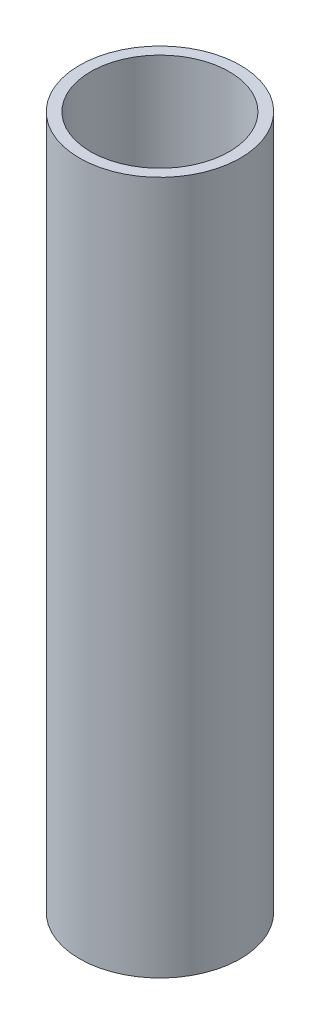
ISO-10303-21;
HEADER;
FILE_DESCRIPTION(('STEP AP214'),'2;1');
FILE_NAME('part.step','',(''),(''),'','','');
FILE_SCHEMA(('AUTOMOTIVE_DESIGN { 1 0 10303 214 1 1 1 1 }'));
ENDSEC;
DATA;
#1=APPLICATION_CONTEXT('core data for automotive mechanical design processes');
#2=APPLICATION_PROTOCOL_DEFINITION('international standard','automotive_design',2000,#1);
#3=PRODUCT_CONTEXT('',#1,'mechanical');
#4=PRODUCT('Part','Part','',(#3));
#5=PRODUCT_RELATED_PRODUCT_CATEGORY('part','',(#4));
#6=PRODUCT_DEFINITION_FORMATION('','',#4);
#7=PRODUCT_DEFINITION_CONTEXT('part definition',#1,'design');
#8=PRODUCT_DEFINITION('design','',#6,#7);
#9=PRODUCT_DEFINITION_SHAPE('','',#8);
#10=(LENGTH_UNIT() NAMED_UNIT(*) SI_UNIT(.MILLI.,.METRE.));
#11=(NAMED_UNIT(*) PLANE_ANGLE_UNIT() SI_UNIT($,.RADIAN.));
#12=(NAMED_UNIT(*) SI_UNIT($,.STERADIAN.) SOLID_ANGLE_UNIT());
#13=UNCERTAINTY_MEASURE_WITH_UNIT(LENGTH_MEASURE(1.E-05),#10,'distance_accuracy_value','');
#14=(GEOMETRIC_REPRESENTATION_CONTEXT(3) GLOBAL_UNCERTAINTY_ASSIGNED_CONTEXT((#13)) GLOBAL_UNIT_ASSIGNED_CONTEXT((#10,
#11,#12)) REPRESENTATION_CONTEXT('',''));
#15=CARTESIAN_POINT('',(0.,0.,0.));
#16=DIRECTION('',(0.,0.,1.));
#17=DIRECTION('',(1.,0.,0.));
#18=AXIS2_PLACEMENT_3D('',#15,#16,#17);
#19=CARTESIAN_POINT('',(0.,63.5,0.));
#20=DIRECTION('',(0.,1.,0.));
#21=DIRECTION('',(0.,0.,1.));
#22=AXIS2_PLACEMENT_3D('',#19,#20,#21);
#23=PLANE('',#22);
#24=CARTESIAN_POINT('',(0.,63.5,0.));
#25=DIRECTION('',(0.,1.,0.));
#26=DIRECTION('',(0.,0.,1.));
#27=AXIS2_PLACEMENT_3D('',#24,#25,#26);
#28=CIRCLE('',#27,7.366);
#29=CARTESIAN_POINT('',(0.,63.5,7.366));
#30=VERTEX_POINT('',#29);
#31=EDGE_CURVE('E10',#30,#30,#28,.T.);
#32=ORIENTED_EDGE('',*,*,#31,.T.);
#33=EDGE_LOOP('',(#32));
#34=FACE_BOUND('',#33,.T.);
#35=CARTESIAN_POINT('',(0.,63.5,0.));
#36=DIRECTION('',(0.,1.,0.));
#37=DIRECTION('',(0.,0.,1.));
#38=AXIS2_PLACEMENT_3D('',#35,#36,#37);
#39=CIRCLE('',#38,6.35);
#40=CARTESIAN_POINT('',(0.,63.5,6.35));
#41=VERTEX_POINT('',#40);
#42=EDGE_CURVE('E41',#41,#41,#39,.T.);
#43=ORIENTED_EDGE('',*,*,#42,.F.);
#44=EDGE_LOOP('',(#43));
#45=FACE_BOUND('',#44,.T.);
#46=ADVANCED_FACE('F30',(#34,#45),#23,.T.);
#47=CARTESIAN_POINT('',(0.,0.,0.));
#48=DIRECTION('',(0.,1.,0.));
#49=DIRECTION('',(0.,0.,1.));
#50=AXIS2_PLACEMENT_3D('',#47,#48,#49);
#51=PLANE('',#50);
#52=CARTESIAN_POINT('',(0.,0.,0.));
#53=DIRECTION('',(0.,1.,0.));
#54=DIRECTION('',(0.,0.,1.));
#55=AXIS2_PLACEMENT_3D('',#52,#53,#54);
#56=CIRCLE('',#55,7.366);
#57=CARTESIAN_POINT('',(0.,0.,7.366));
#58=VERTEX_POINT('',#57);
#59=EDGE_CURVE('E34',#58,#58,#56,.T.);
#60=ORIENTED_EDGE('',*,*,#59,.F.);
#61=EDGE_LOOP('',(#60));
#62=FACE_BOUND('',#61,.T.);
#63=CARTESIAN_POINT('',(0.,0.,0.));
#64=DIRECTION('',(0.,1.,0.));
#65=DIRECTION('',(0.,0.,1.));
#66=AXIS2_PLACEMENT_3D('',#63,#64,#65);
#67=CIRCLE('',#66,6.35);
#68=CARTESIAN_POINT('',(0.,0.,6.35));
#69=VERTEX_POINT('',#68);
#70=EDGE_CURVE('E43',#69,#69,#67,.T.);
#71=ORIENTED_EDGE('',*,*,#70,.T.);
#72=EDGE_LOOP('',(#71));
#73=FACE_BOUND('',#72,.T.);
#74=ADVANCED_FACE('F53',(#62,#73),#51,.F.);
#75=CARTESIAN_POINT('',(0.,63.5,0.));
#76=DIRECTION('',(0.,-1.,0.));
#77=DIRECTION('',(0.,0.,-1.));
#78=AXIS2_PLACEMENT_3D('',#75,#76,#77);
#79=CYLINDRICAL_SURFACE('',#78,7.366);
#80=ORIENTED_EDGE('',*,*,#31,.F.);
#81=EDGE_LOOP('',(#80));
#82=FACE_BOUND('',#81,.T.);
#83=ORIENTED_EDGE('',*,*,#59,.T.);
#84=EDGE_LOOP('',(#83));
#85=FACE_BOUND('',#84,.T.);
#86=ADVANCED_FACE('F32',(#82,#85),#79,.T.);
#87=CARTESIAN_POINT('',(0.,63.5,0.));
#88=DIRECTION('',(0.,-1.,0.));
#89=DIRECTION('',(0.,0.,-1.));
#90=AXIS2_PLACEMENT_3D('',#87,#88,#89);
#91=CYLINDRICAL_SURFACE('',#90,6.35);
#92=ORIENTED_EDGE('',*,*,#42,.T.);
#93=EDGE_LOOP('',(#92));
#94=FACE_BOUND('',#93,.T.);
#95=ORIENTED_EDGE('',*,*,#70,.F.);
#96=EDGE_LOOP('',(#95));
#97=FACE_BOUND('',#96,.T.);
#98=ADVANCED_FACE('F49',(#94,#97),#91,.F.);
#99=CLOSED_SHELL('',(#46,#74,#86,#98));
#100=MANIFOLD_SOLID_BREP('B2',#99);
#101=ADVANCED_BREP_SHAPE_REPRESENTATION('',(#18,#100),#14);
#102=SHAPE_DEFINITION_REPRESENTATION(#9,#101);
ENDSEC;
END-ISO-10303-21;
